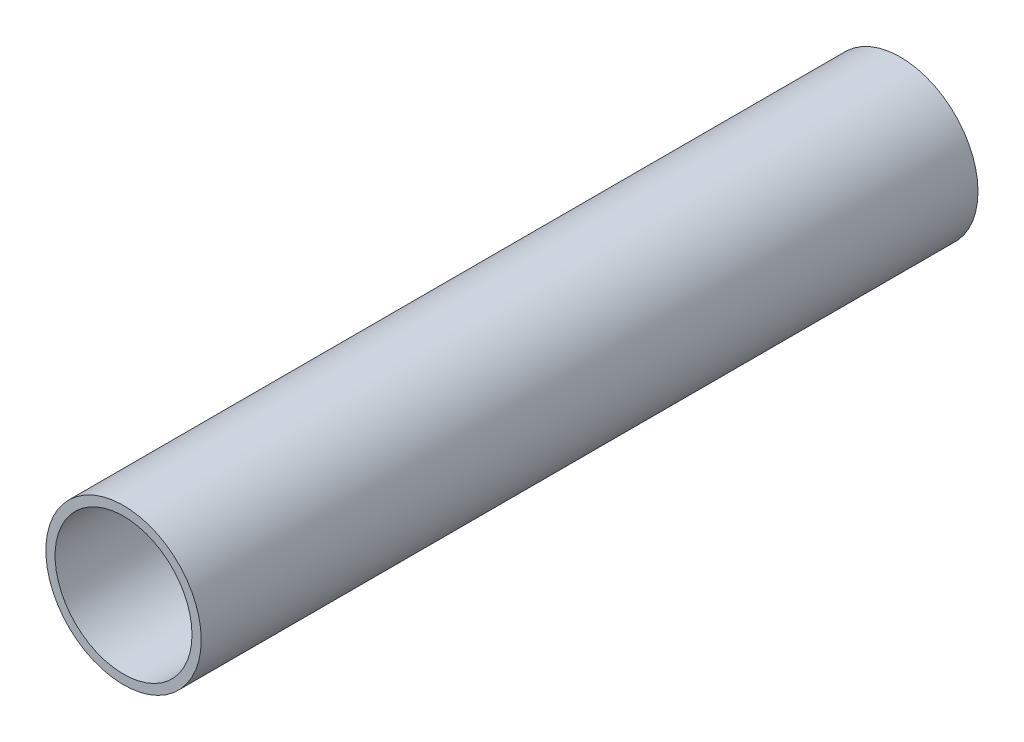
ISO-10303-21;
HEADER;
FILE_DESCRIPTION(('STEP AP214'),'2;1');
FILE_NAME('part.step','',(''),(''),'','','');
FILE_SCHEMA(('AUTOMOTIVE_DESIGN { 1 0 10303 214 1 1 1 1 }'));
ENDSEC;
DATA;
#1=APPLICATION_CONTEXT('core data for automotive mechanical design processes');
#2=APPLICATION_PROTOCOL_DEFINITION('international standard','automotive_design',2000,#1);
#3=PRODUCT_CONTEXT('',#1,'mechanical');
#4=PRODUCT('Part','Part','',(#3));
#5=PRODUCT_RELATED_PRODUCT_CATEGORY('part','',(#4));
#6=PRODUCT_DEFINITION_FORMATION('','',#4);
#7=PRODUCT_DEFINITION_CONTEXT('part definition',#1,'design');
#8=PRODUCT_DEFINITION('design','',#6,#7);
#9=PRODUCT_DEFINITION_SHAPE('','',#8);
#10=(LENGTH_UNIT() NAMED_UNIT(*) SI_UNIT(.MILLI.,.METRE.));
#11=(NAMED_UNIT(*) PLANE_ANGLE_UNIT() SI_UNIT($,.RADIAN.));
#12=(NAMED_UNIT(*) SI_UNIT($,.STERADIAN.) SOLID_ANGLE_UNIT());
#13=UNCERTAINTY_MEASURE_WITH_UNIT(LENGTH_MEASURE(1.E-05),#10,'distance_accuracy_value','');
#14=(GEOMETRIC_REPRESENTATION_CONTEXT(3) GLOBAL_UNCERTAINTY_ASSIGNED_CONTEXT((#13)) GLOBAL_UNIT_ASSIGNED_CONTEXT((#10,
#11,#12)) REPRESENTATION_CONTEXT('',''));
#15=CARTESIAN_POINT('',(0.,0.,0.));
#16=DIRECTION('',(0.,0.,1.));
#17=DIRECTION('',(1.,0.,0.));
#18=AXIS2_PLACEMENT_3D('',#15,#16,#17);
#19=CARTESIAN_POINT('',(0.,0.,160.));
#20=DIRECTION('',(0.,0.,1.));
#21=DIRECTION('',(1.,0.,0.));
#22=AXIS2_PLACEMENT_3D('',#19,#20,#21);
#23=PLANE('',#22);
#24=CARTESIAN_POINT('',(0.,0.,160.));
#25=DIRECTION('',(0.,0.,1.));
#26=DIRECTION('',(1.,0.,0.));
#27=AXIS2_PLACEMENT_3D('',#24,#25,#26);
#28=CIRCLE('',#27,16.);
#29=CARTESIAN_POINT('',(16.,0.,160.));
#30=VERTEX_POINT('',#29);
#31=EDGE_CURVE('E10',#30,#30,#28,.T.);
#32=ORIENTED_EDGE('',*,*,#31,.T.);
#33=EDGE_LOOP('',(#32));
#34=FACE_BOUND('',#33,.T.);
#35=CARTESIAN_POINT('',(0.,0.,160.));
#36=DIRECTION('',(0.,0.,1.));
#37=DIRECTION('',(1.,0.,0.));
#38=AXIS2_PLACEMENT_3D('',#35,#36,#37);
#39=CIRCLE('',#38,14.1);
#40=CARTESIAN_POINT('',(14.1,0.,160.));
#41=VERTEX_POINT('',#40);
#42=EDGE_CURVE('E42',#41,#41,#39,.T.);
#43=ORIENTED_EDGE('',*,*,#42,.F.);
#44=EDGE_LOOP('',(#43));
#45=FACE_BOUND('',#44,.T.);
#46=ADVANCED_FACE('F31',(#34,#45),#23,.T.);
#47=CARTESIAN_POINT('',(0.,0.,0.));
#48=DIRECTION('',(0.,0.,1.));
#49=DIRECTION('',(1.,0.,0.));
#50=AXIS2_PLACEMENT_3D('',#47,#48,#49);
#51=PLANE('',#50);
#52=CARTESIAN_POINT('',(0.,0.,0.));
#53=DIRECTION('',(0.,0.,1.));
#54=DIRECTION('',(1.,0.,0.));
#55=AXIS2_PLACEMENT_3D('',#52,#53,#54);
#56=CIRCLE('',#55,16.);
#57=CARTESIAN_POINT('',(16.,0.,0.));
#58=VERTEX_POINT('',#57);
#59=EDGE_CURVE('E35',#58,#58,#56,.T.);
#60=ORIENTED_EDGE('',*,*,#59,.F.);
#61=EDGE_LOOP('',(#60));
#62=FACE_BOUND('',#61,.T.);
#63=CARTESIAN_POINT('',(0.,0.,0.));
#64=DIRECTION('',(0.,0.,1.));
#65=DIRECTION('',(1.,0.,0.));
#66=AXIS2_PLACEMENT_3D('',#63,#64,#65);
#67=CIRCLE('',#66,14.1);
#68=CARTESIAN_POINT('',(14.1,0.,0.));
#69=VERTEX_POINT('',#68);
#70=EDGE_CURVE('E44',#69,#69,#67,.T.);
#71=ORIENTED_EDGE('',*,*,#70,.T.);
#72=EDGE_LOOP('',(#71));
#73=FACE_BOUND('',#72,.T.);
#74=ADVANCED_FACE('F54',(#62,#73),#51,.F.);
#75=CARTESIAN_POINT('',(0.,0.,160.));
#76=DIRECTION('',(0.,0.,-1.));
#77=DIRECTION('',(-1.,0.,0.));
#78=AXIS2_PLACEMENT_3D('',#75,#76,#77);
#79=CYLINDRICAL_SURFACE('',#78,16.);
#80=ORIENTED_EDGE('',*,*,#31,.F.);
#81=EDGE_LOOP('',(#80));
#82=FACE_BOUND('',#81,.T.);
#83=ORIENTED_EDGE('',*,*,#59,.T.);
#84=EDGE_LOOP('',(#83));
#85=FACE_BOUND('',#84,.T.);
#86=ADVANCED_FACE('F33',(#82,#85),#79,.T.);
#87=CARTESIAN_POINT('',(0.,0.,160.));
#88=DIRECTION('',(0.,0.,-1.));
#89=DIRECTION('',(-1.,0.,0.));
#90=AXIS2_PLACEMENT_3D('',#87,#88,#89);
#91=CYLINDRICAL_SURFACE('',#90,14.1);
#92=ORIENTED_EDGE('',*,*,#42,.T.);
#93=EDGE_LOOP('',(#92));
#94=FACE_BOUND('',#93,.T.);
#95=ORIENTED_EDGE('',*,*,#70,.F.);
#96=EDGE_LOOP('',(#95));
#97=FACE_BOUND('',#96,.T.);
#98=ADVANCED_FACE('F50',(#94,#97),#91,.F.);
#99=CLOSED_SHELL('',(#46,#74,#86,#98));
#100=MANIFOLD_SOLID_BREP('B2',#99);
#101=ADVANCED_BREP_SHAPE_REPRESENTATION('',(#18,#100),#14);
#102=SHAPE_DEFINITION_REPRESENTATION(#9,#101);
ENDSEC;
END-ISO-10303-21;
